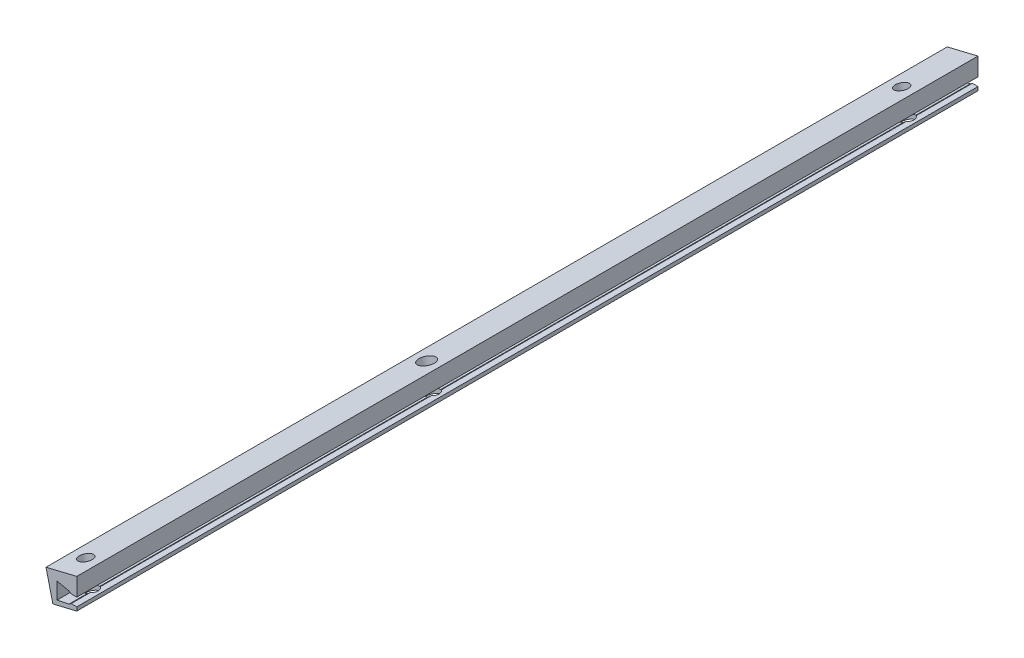
ISO-10303-21;
HEADER;
FILE_DESCRIPTION(('STEP AP214'),'2;1');
FILE_NAME('part.step','',(''),(''),'','','');
FILE_SCHEMA(('AUTOMOTIVE_DESIGN { 1 0 10303 214 1 1 1 1 }'));
ENDSEC;
DATA;
#1=APPLICATION_CONTEXT('core data for automotive mechanical design processes');
#2=APPLICATION_PROTOCOL_DEFINITION('international standard','automotive_design',2000,#1);
#3=PRODUCT_CONTEXT('',#1,'mechanical');
#4=PRODUCT('Part','Part','',(#3));
#5=PRODUCT_RELATED_PRODUCT_CATEGORY('part','',(#4));
#6=PRODUCT_DEFINITION_FORMATION('','',#4);
#7=PRODUCT_DEFINITION_CONTEXT('part definition',#1,'design');
#8=PRODUCT_DEFINITION('design','',#6,#7);
#9=PRODUCT_DEFINITION_SHAPE('','',#8);
#10=(LENGTH_UNIT() NAMED_UNIT(*) SI_UNIT(.MILLI.,.METRE.));
#11=(NAMED_UNIT(*) PLANE_ANGLE_UNIT() SI_UNIT($,.RADIAN.));
#12=(NAMED_UNIT(*) SI_UNIT($,.STERADIAN.) SOLID_ANGLE_UNIT());
#13=UNCERTAINTY_MEASURE_WITH_UNIT(LENGTH_MEASURE(1.E-05),#10,'distance_accuracy_value','');
#14=(GEOMETRIC_REPRESENTATION_CONTEXT(3) GLOBAL_UNCERTAINTY_ASSIGNED_CONTEXT((#13)) GLOBAL_UNIT_ASSIGNED_CONTEXT((#10,
#11,#12)) REPRESENTATION_CONTEXT('',''));
#15=CARTESIAN_POINT('',(0.,0.,0.));
#16=DIRECTION('',(0.,0.,1.));
#17=DIRECTION('',(1.,0.,0.));
#18=AXIS2_PLACEMENT_3D('',#15,#16,#17);
#19=CARTESIAN_POINT('',(59.958612412913,1.62114936826575,248.819721939639));
#20=DIRECTION('',(0.207911690817757,0.978147600733806,0.));
#21=DIRECTION('',(-0.978147600733806,0.207911690817757,0.));
#22=AXIS2_PLACEMENT_3D('',#19,#20,#21);
#23=PLANE('',#22);
#24=CARTESIAN_POINT('',(58.6808585005971,1.89274434652803,139.7));
#25=DIRECTION('',(0.207911690817757,0.978147600733806,0.));
#26=DIRECTION('',(-0.978147600733806,0.207911690817757,0.));
#27=AXIS2_PLACEMENT_3D('',#24,#25,#26);
#28=ELLIPSE('',#27,2.16681515513089,1.95386478333267);
#29=CARTESIAN_POINT('',(56.834412412913,2.28521857823523,140.659259564191));
#30=VERTEX_POINT('',#29);
#31=CARTESIAN_POINT('',(59.3577274417419,1.74887141169708,141.551548722555));
#32=VERTEX_POINT('',#31);
#33=EDGE_CURVE('E306',#30,#32,#28,.T.);
#34=ORIENTED_EDGE('',*,*,#33,.T.);
#35=DIRECTION('',(0.,0.,-1.));
#36=VECTOR('',#35,1.);
#37=CARTESIAN_POINT('',(59.3577274417419,1.74887141169707,248.819721939639));
#38=LINE('',#37,#36);
#39=CARTESIAN_POINT('',(59.3577274417419,1.74887141169707,141.323519295234));
#40=VERTEX_POINT('',#39);
#41=EDGE_CURVE('E42',#32,#40,#38,.T.);
#42=ORIENTED_EDGE('',*,*,#41,.T.);
#43=CARTESIAN_POINT('',(58.7184617697407,1.88475152493132,139.7));
#44=DIRECTION('',(0.207911690817757,0.978147600733806,0.));
#45=DIRECTION('',(-0.978147600733806,0.207911690817757,0.));
#46=AXIS2_PLACEMENT_3D('',#43,#44,#45);
#47=ELLIPSE('',#46,1.91514484381711,1.7272);
#48=CARTESIAN_POINT('',(59.958612412913,1.62114936826575,140.9945187615));
#49=VERTEX_POINT('',#48);
#50=EDGE_CURVE('E315',#40,#49,#47,.T.);
#51=ORIENTED_EDGE('',*,*,#50,.T.);
#52=DIRECTION('',(0.,0.,-1.));
#53=VECTOR('',#52,1.);
#54=CARTESIAN_POINT('',(59.958612412913,1.62114936826575,248.819721939639));
#55=LINE('',#54,#53);
#56=CARTESIAN_POINT('',(59.958612412913,1.62114936826575,227.267007538489));
#57=VERTEX_POINT('',#56);
#58=EDGE_CURVE('E279',#57,#49,#55,.T.);
#59=ORIENTED_EDGE('',*,*,#58,.F.);
#60=CARTESIAN_POINT('',(58.7184617697407,1.88475152493132,228.561526299989));
#61=DIRECTION('',(0.207911690817757,0.978147600733806,0.));
#62=DIRECTION('',(-0.978147600733806,0.207911690817757,0.));
#63=AXIS2_PLACEMENT_3D('',#60,#61,#62);
#64=ELLIPSE('',#63,1.91514484381711,1.7272);
#65=CARTESIAN_POINT('',(59.958612412913,1.62114936826575,229.856045061488));
#66=VERTEX_POINT('',#65);
#67=EDGE_CURVE('E412',#57,#66,#64,.T.);
#68=ORIENTED_EDGE('',*,*,#67,.T.);
#69=CARTESIAN_POINT('',(59.958612412913,1.62114936826575,234.911526299989));
#70=VERTEX_POINT('',#69);
#71=EDGE_CURVE('E275',#70,#66,#55,.T.);
#72=ORIENTED_EDGE('',*,*,#71,.F.);
#73=DIRECTION('',(0.978147600733806,-0.207911690817757,0.));
#74=VECTOR('',#73,1.);
#75=CARTESIAN_POINT('',(56.834412412913,2.28521857823523,234.911526299989));
#76=LINE('',#75,#74);
#77=CARTESIAN_POINT('',(56.834412412913,2.28521857823523,234.911526299989));
#78=VERTEX_POINT('',#77);
#79=EDGE_CURVE('E368',#78,#70,#76,.T.);
#80=ORIENTED_EDGE('',*,*,#79,.F.);
#81=DIRECTION('',(0.,0.,-1.));
#82=VECTOR('',#81,1.);
#83=CARTESIAN_POINT('',(56.834412412913,2.28521857823523,248.819721939639));
#84=LINE('',#83,#82);
#85=EDGE_CURVE('E280',#78,#30,#84,.T.);
#86=ORIENTED_EDGE('',*,*,#85,.T.);
#87=EDGE_LOOP('',(#34,#42,#51,#59,#68,#72,#80,#86));
#88=FACE_BOUND('',#87,.T.);
#89=ADVANCED_FACE('F33',(#88),#23,.F.);
#90=CARTESIAN_POINT('',(59.958612412913,1.62114936826575,248.819721939639));
#91=DIRECTION('',(0.573576436351041,0.819152044288996,0.));
#92=DIRECTION('',(-0.819152044288996,0.573576436351041,0.));
#93=AXIS2_PLACEMENT_3D('',#90,#91,#92);
#94=PLANE('',#93);
#95=ORIENTED_EDGE('',*,*,#71,.T.);
#96=CARTESIAN_POINT('',(58.5423833987237,2.61280359983237,228.561526299989));
#97=DIRECTION('',(0.573576436351041,0.819152044288996,0.));
#98=DIRECTION('',(-0.819152044288996,0.573576436351041,0.));
#99=AXIS2_PLACEMENT_3D('',#96,#97,#98);
#100=ELLIPSE('',#99,2.61156322728282,1.7272);
#101=CARTESIAN_POINT('',(60.5247028481059,1.22476857823525,229.210889323264));
#102=VERTEX_POINT('',#101);
#103=EDGE_CURVE('E411',#66,#102,#100,.T.);
#104=ORIENTED_EDGE('',*,*,#103,.T.);
#105=DIRECTION('',(0.,0.,-1.));
#106=VECTOR('',#105,1.);
#107=CARTESIAN_POINT('',(60.5247028481059,1.22476857823525,248.819721939639));
#108=LINE('',#107,#106);
#109=CARTESIAN_POINT('',(60.5247028481059,1.22476857823525,234.911526299989));
#110=VERTEX_POINT('',#109);
#111=EDGE_CURVE('E270',#110,#102,#108,.T.);
#112=ORIENTED_EDGE('',*,*,#111,.F.);
#113=DIRECTION('',(0.819152044288995,-0.573576436351042,0.));
#114=VECTOR('',#113,1.);
#115=CARTESIAN_POINT('',(59.958612412913,1.62114936826575,234.911526299989));
#116=LINE('',#115,#114);
#117=EDGE_CURVE('E370',#70,#110,#116,.T.);
#118=ORIENTED_EDGE('',*,*,#117,.F.);
#119=EDGE_LOOP('',(#95,#104,#112,#118));
#120=FACE_BOUND('',#119,.T.);
#121=ADVANCED_FACE('F454',(#120),#94,.F.);
#122=CARTESIAN_POINT('',(59.9586124129129,-1.35601221179529,248.819721939639));
#123=DIRECTION('',(0.57357643635104,-0.819152044288996,0.));
#124=DIRECTION('',(0.819152044288996,0.57357643635104,0.));
#125=AXIS2_PLACEMENT_3D('',#122,#123,#124);
#126=PLANE('',#125);
#127=DIRECTION('',(0.,0.,-1.));
#128=VECTOR('',#127,1.);
#129=CARTESIAN_POINT('',(60.5247028481059,-0.959631421764766,248.819721939639));
#130=LINE('',#129,#128);
#131=CARTESIAN_POINT('',(60.5247028481059,-0.959631421764765,234.911526299989));
#132=VERTEX_POINT('',#131);
#133=CARTESIAN_POINT('',(60.5247028481059,-0.959631421764766,229.903787627549));
#134=VERTEX_POINT('',#133);
#135=EDGE_CURVE('E291',#132,#134,#130,.T.);
#136=ORIENTED_EDGE('',*,*,#135,.T.);
#137=CARTESIAN_POINT('',(59.568328281914,-1.62929210236432,228.561526299989));
#138=DIRECTION('',(0.57357643635104,-0.819152044288996,0.));
#139=DIRECTION('',(0.819152044288996,0.57357643635104,0.));
#140=AXIS2_PLACEMENT_3D('',#137,#138,#139);
#141=ELLIPSE('',#140,1.85515103406872,1.7272);
#142=CARTESIAN_POINT('',(59.9586124129129,-1.35601221179529,230.230792479924));
#143=VERTEX_POINT('',#142);
#144=EDGE_CURVE('E404',#134,#143,#141,.T.);
#145=ORIENTED_EDGE('',*,*,#144,.T.);
#146=DIRECTION('',(0.,0.,-1.));
#147=VECTOR('',#146,1.);
#148=CARTESIAN_POINT('',(59.9586124129129,-1.35601221179529,248.819721939639));
#149=LINE('',#148,#147);
#150=CARTESIAN_POINT('',(59.9586124129129,-1.35601221179529,234.911526299989));
#151=VERTEX_POINT('',#150);
#152=EDGE_CURVE('E286',#151,#143,#149,.T.);
#153=ORIENTED_EDGE('',*,*,#152,.F.);
#154=DIRECTION('',(-0.819152044288996,-0.573576436351041,0.));
#155=VECTOR('',#154,1.);
#156=CARTESIAN_POINT('',(60.5247028481059,-0.959631421764765,234.911526299989));
#157=LINE('',#156,#155);
#158=EDGE_CURVE('E362',#132,#151,#157,.T.);
#159=ORIENTED_EDGE('',*,*,#158,.F.);
#160=EDGE_LOOP('',(#136,#145,#153,#159));
#161=FACE_BOUND('',#160,.T.);
#162=ADVANCED_FACE('F483',(#161),#126,.F.);
#163=CARTESIAN_POINT('',(60.5247028481059,1.22476857823525,227.912163276713));
#164=VERTEX_POINT('',#163);
#165=CARTESIAN_POINT('',(60.5247028481059,1.22476857823525,140.349363023275));
#166=VERTEX_POINT('',#165);
#167=EDGE_CURVE('E274',#164,#166,#108,.T.);
#168=ORIENTED_EDGE('',*,*,#167,.F.);
#169=EDGE_CURVE('E57',#164,#57,#100,.T.);
#170=ORIENTED_EDGE('',*,*,#169,.T.);
#171=ORIENTED_EDGE('',*,*,#58,.T.);
#172=CARTESIAN_POINT('',(58.5423833987237,2.61280359983237,139.7));
#173=DIRECTION('',(0.573576436351041,0.819152044288996,0.));
#174=DIRECTION('',(-0.819152044288996,0.573576436351041,0.));
#175=AXIS2_PLACEMENT_3D('',#172,#173,#174);
#176=ELLIPSE('',#175,2.61156322728282,1.7272);
#177=EDGE_CURVE('E325',#49,#166,#176,.T.);
#178=ORIENTED_EDGE('',*,*,#177,.T.);
#179=EDGE_LOOP('',(#168,#170,#171,#178));
#180=FACE_BOUND('',#179,.T.);
#181=ADVANCED_FACE('F448',(#180),#94,.F.);
#182=CARTESIAN_POINT('',(59.9586124129129,-1.35601221179529,226.892260120053));
#183=VERTEX_POINT('',#182);
#184=CARTESIAN_POINT('',(59.9586124129129,-1.35601221179529,141.369266179935));
#185=VERTEX_POINT('',#184);
#186=EDGE_CURVE('E290',#183,#185,#149,.T.);
#187=ORIENTED_EDGE('',*,*,#186,.F.);
#188=CARTESIAN_POINT('',(60.5247028481059,-0.959631421764766,227.219264972428));
#189=VERTEX_POINT('',#188);
#190=EDGE_CURVE('E401',#183,#189,#141,.T.);
#191=ORIENTED_EDGE('',*,*,#190,.T.);
#192=CARTESIAN_POINT('',(60.5247028481059,-0.959631421764766,141.04226132756));
#193=VERTEX_POINT('',#192);
#194=EDGE_CURVE('E295',#189,#193,#130,.T.);
#195=ORIENTED_EDGE('',*,*,#194,.T.);
#196=CARTESIAN_POINT('',(59.568328281914,-1.62929210236432,139.7));
#197=DIRECTION('',(0.57357643635104,-0.819152044288996,0.));
#198=DIRECTION('',(0.819152044288996,0.57357643635104,0.));
#199=AXIS2_PLACEMENT_3D('',#196,#197,#198);
#200=ELLIPSE('',#199,1.85515103406872,1.7272);
#201=EDGE_CURVE('E418',#193,#185,#200,.T.);
#202=ORIENTED_EDGE('',*,*,#201,.T.);
#203=EDGE_LOOP('',(#187,#191,#195,#202));
#204=FACE_BOUND('',#203,.T.);
#205=ADVANCED_FACE('F490',(#204),#126,.F.);
#206=CARTESIAN_POINT('',(60.5247028481059,1.22476857823525,139.050636976724));
#207=VERTEX_POINT('',#206);
#208=CARTESIAN_POINT('',(60.5247028481059,1.22476857823525,16.5243630232753));
#209=VERTEX_POINT('',#208);
#210=EDGE_CURVE('E432',#207,#209,#108,.T.);
#211=ORIENTED_EDGE('',*,*,#210,.F.);
#212=CARTESIAN_POINT('',(59.958612412913,1.62114936826575,138.4054812385));
#213=VERTEX_POINT('',#212);
#214=EDGE_CURVE('E329',#207,#213,#176,.T.);
#215=ORIENTED_EDGE('',*,*,#214,.T.);
#216=CARTESIAN_POINT('',(59.958612412913,1.62114936826575,17.1695187614996));
#217=VERTEX_POINT('',#216);
#218=EDGE_CURVE('E430',#213,#217,#55,.T.);
#219=ORIENTED_EDGE('',*,*,#218,.T.);
#220=CARTESIAN_POINT('',(58.5423833987236,2.61280359983242,15.8749999999998));
#221=DIRECTION('',(0.573576436351041,0.819152044288996,0.));
#222=DIRECTION('',(-0.819152044288996,0.573576436351041,0.));
#223=AXIS2_PLACEMENT_3D('',#220,#221,#222);
#224=ELLIPSE('',#223,2.61156322728281,1.72719999999999);
#225=EDGE_CURVE('E351',#217,#209,#224,.T.);
#226=ORIENTED_EDGE('',*,*,#225,.T.);
#227=EDGE_LOOP('',(#211,#215,#219,#226));
#228=FACE_BOUND('',#227,.T.);
#229=ADVANCED_FACE('F428',(#228),#94,.F.);
#230=CARTESIAN_POINT('',(59.9586124129129,-1.35601221179529,138.030733820064));
#231=VERTEX_POINT('',#230);
#232=CARTESIAN_POINT('',(59.9586124129129,-1.35601221179529,17.5442661799356));
#233=VERTEX_POINT('',#232);
#234=EDGE_CURVE('E471',#231,#233,#149,.T.);
#235=ORIENTED_EDGE('',*,*,#234,.F.);
#236=CARTESIAN_POINT('',(60.5247028481059,-0.959631421764766,138.35773867244));
#237=VERTEX_POINT('',#236);
#238=EDGE_CURVE('E415',#231,#237,#200,.T.);
#239=ORIENTED_EDGE('',*,*,#238,.T.);
#240=CARTESIAN_POINT('',(60.5247028481059,-0.959631421764766,17.2172613275601));
#241=VERTEX_POINT('',#240);
#242=EDGE_CURVE('E475',#237,#241,#130,.T.);
#243=ORIENTED_EDGE('',*,*,#242,.T.);
#244=CARTESIAN_POINT('',(59.568328281914,-1.62929210236435,15.8749999999998));
#245=DIRECTION('',(0.57357643635104,-0.819152044288996,0.));
#246=DIRECTION('',(0.819152044288996,0.57357643635104,0.));
#247=AXIS2_PLACEMENT_3D('',#244,#245,#246);
#248=ELLIPSE('',#247,1.85515103406871,1.72719999999999);
#249=EDGE_CURVE('E341',#241,#233,#248,.T.);
#250=ORIENTED_EDGE('',*,*,#249,.T.);
#251=EDGE_LOOP('',(#235,#239,#243,#250));
#252=FACE_BOUND('',#251,.T.);
#253=ADVANCED_FACE('F498',(#252),#126,.F.);
#254=CARTESIAN_POINT('',(0.,0.,0.));
#255=DIRECTION('',(0.,0.,-1.));
#256=DIRECTION('',(-1.,0.,0.));
#257=AXIS2_PLACEMENT_3D('',#254,#255,#256);
#258=PLANE('',#257);
#259=DIRECTION('',(-0.971978073490253,-0.235071530930855,0.));
#260=VECTOR('',#259,1.);
#261=CARTESIAN_POINT('',(55.7581784819439,-3.43350010678022,0.));
#262=LINE('',#261,#260);
#263=CARTESIAN_POINT('',(61.990612412913,-1.92619472043808,0.));
#264=VERTEX_POINT('',#263);
#265=CARTESIAN_POINT('',(55.7581784819439,-3.43350010678022,0.));
#266=VERTEX_POINT('',#265);
#267=EDGE_CURVE('E213',#264,#266,#262,.T.);
#268=ORIENTED_EDGE('',*,*,#267,.T.);
#269=DIRECTION('',(0.235071530930851,-0.971978073490254,0.));
#270=VECTOR('',#269,1.);
#271=CARTESIAN_POINT('',(53.9669334162508,3.97297281321551,0.));
#272=LINE('',#271,#270);
#273=CARTESIAN_POINT('',(53.9669334162508,3.97297281321551,0.));
#274=VERTEX_POINT('',#273);
#275=EDGE_CURVE('E376',#274,#266,#272,.T.);
#276=ORIENTED_EDGE('',*,*,#275,.F.);
#277=DIRECTION('',(0.971978073490256,0.235071530930842,0.));
#278=VECTOR('',#277,1.);
#279=CARTESIAN_POINT('',(2.07437631216601,-8.57716918594505,0.));
#280=LINE('',#279,#278);
#281=CARTESIAN_POINT('',(61.990612412913,5.91348830104975,0.));
#282=VERTEX_POINT('',#281);
#283=EDGE_CURVE('E243',#274,#282,#280,.T.);
#284=ORIENTED_EDGE('',*,*,#283,.T.);
#285=DIRECTION('',(0.,1.,0.));
#286=VECTOR('',#285,1.);
#287=CARTESIAN_POINT('',(61.990612412913,3.57048443495228,0.));
#288=LINE('',#287,#286);
#289=CARTESIAN_POINT('',(61.990612412913,1.22476857823525,0.));
#290=VERTEX_POINT('',#289);
#291=EDGE_CURVE('E264',#290,#282,#288,.T.);
#292=ORIENTED_EDGE('',*,*,#291,.F.);
#293=DIRECTION('',(1.,0.,0.));
#294=VECTOR('',#293,1.);
#295=CARTESIAN_POINT('',(61.990612412913,1.22476857823525,0.));
#296=LINE('',#295,#294);
#297=CARTESIAN_POINT('',(60.5247028481059,1.22476857823525,0.));
#298=VERTEX_POINT('',#297);
#299=EDGE_CURVE('E261',#298,#290,#296,.T.);
#300=ORIENTED_EDGE('',*,*,#299,.F.);
#301=DIRECTION('',(0.819152044288996,-0.573576436351041,0.));
#302=VECTOR('',#301,1.);
#303=CARTESIAN_POINT('',(59.958612412913,1.62114936826575,0.));
#304=LINE('',#303,#302);
#305=CARTESIAN_POINT('',(59.958612412913,1.62114936826575,0.));
#306=VERTEX_POINT('',#305);
#307=EDGE_CURVE('E258',#306,#298,#304,.T.);
#308=ORIENTED_EDGE('',*,*,#307,.F.);
#309=DIRECTION('',(0.978147600733806,-0.207911690817757,0.));
#310=VECTOR('',#309,1.);
#311=CARTESIAN_POINT('',(59.958612412913,1.62114936826575,0.));
#312=LINE('',#311,#310);
#313=CARTESIAN_POINT('',(56.834412412913,2.28521857823523,0.));
#314=VERTEX_POINT('',#313);
#315=EDGE_CURVE('E255',#314,#306,#312,.T.);
#316=ORIENTED_EDGE('',*,*,#315,.F.);
#317=DIRECTION('',(0.,1.,0.));
#318=VECTOR('',#317,1.);
#319=CARTESIAN_POINT('',(56.834412412913,2.28521857823523,0.));
#320=LINE('',#319,#318);
#321=CARTESIAN_POINT('',(56.834412412913,-2.02008142176476,0.));
#322=VERTEX_POINT('',#321);
#323=EDGE_CURVE('E252',#322,#314,#320,.T.);
#324=ORIENTED_EDGE('',*,*,#323,.F.);
#325=DIRECTION('',(-0.978147600733805,-0.207911690817762,0.));
#326=VECTOR('',#325,1.);
#327=CARTESIAN_POINT('',(56.834412412913,-2.02008142176476,0.));
#328=LINE('',#327,#326);
#329=CARTESIAN_POINT('',(59.9586124129129,-1.35601221179529,0.));
#330=VERTEX_POINT('',#329);
#331=EDGE_CURVE('E249',#330,#322,#328,.T.);
#332=ORIENTED_EDGE('',*,*,#331,.F.);
#333=DIRECTION('',(-0.819152044288996,-0.57357643635104,0.));
#334=VECTOR('',#333,1.);
#335=CARTESIAN_POINT('',(59.9586124129129,-1.35601221179529,0.));
#336=LINE('',#335,#334);
#337=CARTESIAN_POINT('',(60.5247028481059,-0.959631421764766,0.));
#338=VERTEX_POINT('',#337);
#339=EDGE_CURVE('E241',#338,#330,#336,.T.);
#340=ORIENTED_EDGE('',*,*,#339,.F.);
#341=DIRECTION('',(-1.,0.,0.));
#342=VECTOR('',#341,1.);
#343=CARTESIAN_POINT('',(60.5247028481059,-0.959631421764766,0.));
#344=LINE('',#343,#342);
#345=CARTESIAN_POINT('',(61.990612412913,-0.959631421764751,0.));
#346=VERTEX_POINT('',#345);
#347=EDGE_CURVE('E238',#346,#338,#344,.T.);
#348=ORIENTED_EDGE('',*,*,#347,.F.);
#349=DIRECTION('',(0.,1.,0.));
#350=VECTOR('',#349,1.);
#351=CARTESIAN_POINT('',(61.990612412913,-0.959631421764751,0.));
#352=LINE('',#351,#350);
#353=EDGE_CURVE('E230',#264,#346,#352,.T.);
#354=ORIENTED_EDGE('',*,*,#353,.F.);
#355=EDGE_LOOP('',(#268,#276,#284,#292,#300,#308,#316,#324,#332,#340,#348,#354));
#356=FACE_BOUND('',#355,.T.);
#357=ADVANCED_FACE('F235',(#356),#258,.T.);
#358=CARTESIAN_POINT('',(61.990612412913,3.57048443495228,248.819721939639));
#359=DIRECTION('',(-1.,0.,0.));
#360=DIRECTION('',(0.,-1.,0.));
#361=AXIS2_PLACEMENT_3D('',#358,#359,#360);
#362=PLANE('',#361);
#363=DIRECTION('',(0.,0.,-1.));
#364=VECTOR('',#363,1.);
#365=CARTESIAN_POINT('',(61.990612412913,5.91348830104975,242.911985465671));
#366=LINE('',#365,#364);
#367=CARTESIAN_POINT('',(61.990612412913,5.91348830104975,234.911526299989));
#368=VERTEX_POINT('',#367);
#369=EDGE_CURVE('E239',#368,#282,#366,.T.);
#370=ORIENTED_EDGE('',*,*,#369,.F.);
#371=DIRECTION('',(0.,1.,0.));
#372=VECTOR('',#371,1.);
#373=CARTESIAN_POINT('',(61.990612412913,1.22476857823525,234.911526299989));
#374=LINE('',#373,#372);
#375=CARTESIAN_POINT('',(61.990612412913,1.22476857823525,234.911526299989));
#376=VERTEX_POINT('',#375);
#377=EDGE_CURVE('E355',#376,#368,#374,.T.);
#378=ORIENTED_EDGE('',*,*,#377,.F.);
#379=DIRECTION('',(0.,0.,-1.));
#380=VECTOR('',#379,1.);
#381=CARTESIAN_POINT('',(61.990612412913,1.22476857823525,248.819721939639));
#382=LINE('',#381,#380);
#383=EDGE_CURVE('E267',#376,#290,#382,.T.);
#384=ORIENTED_EDGE('',*,*,#383,.T.);
#385=ORIENTED_EDGE('',*,*,#291,.T.);
#386=EDGE_LOOP('',(#370,#378,#384,#385));
#387=FACE_BOUND('',#386,.T.);
#388=ADVANCED_FACE('F532',(#387),#362,.F.);
#389=CARTESIAN_POINT('',(61.990612412913,1.22476857823525,248.819721939639));
#390=DIRECTION('',(0.,1.,0.));
#391=DIRECTION('',(0.,0.,1.));
#392=AXIS2_PLACEMENT_3D('',#389,#390,#391);
#393=PLANE('',#392);
#394=ORIENTED_EDGE('',*,*,#111,.T.);
#395=CARTESIAN_POINT('',(58.8780777177743,1.22476857823525,228.561526299989));
#396=DIRECTION('',(0.,1.,0.));
#397=DIRECTION('',(-1.,0.,0.));
#398=AXIS2_PLACEMENT_3D('',#395,#396,#397);
#399=ELLIPSE('',#398,1.7769948182039,1.7272);
#400=EDGE_CURVE('E408',#102,#164,#399,.T.);
#401=ORIENTED_EDGE('',*,*,#400,.T.);
#402=ORIENTED_EDGE('',*,*,#167,.T.);
#403=CARTESIAN_POINT('',(58.8780777177743,1.22476857823525,139.7));
#404=DIRECTION('',(0.,1.,0.));
#405=DIRECTION('',(-1.,0.,0.));
#406=AXIS2_PLACEMENT_3D('',#403,#404,#405);
#407=ELLIPSE('',#406,1.7769948182039,1.7272);
#408=EDGE_CURVE('E421',#166,#207,#407,.T.);
#409=ORIENTED_EDGE('',*,*,#408,.T.);
#410=ORIENTED_EDGE('',*,*,#210,.T.);
#411=CARTESIAN_POINT('',(58.8780777177743,1.22476857823525,15.8749999999998));
#412=DIRECTION('',(0.,1.,0.));
#413=DIRECTION('',(-1.,0.,0.));
#414=AXIS2_PLACEMENT_3D('',#411,#412,#413);
#415=ELLIPSE('',#414,1.7769948182039,1.72719999999999);
#416=CARTESIAN_POINT('',(60.5247028481059,1.22476857823525,15.2256369767246));
#417=VERTEX_POINT('',#416);
#418=EDGE_CURVE('E352',#209,#417,#415,.T.);
#419=ORIENTED_EDGE('',*,*,#418,.T.);
#420=EDGE_CURVE('E269',#417,#298,#108,.T.);
#421=ORIENTED_EDGE('',*,*,#420,.T.);
#422=ORIENTED_EDGE('',*,*,#299,.T.);
#423=ORIENTED_EDGE('',*,*,#383,.F.);
#424=DIRECTION('',(1.,0.,0.));
#425=VECTOR('',#424,1.);
#426=CARTESIAN_POINT('',(60.5247028481059,1.22476857823525,234.911526299989));
#427=LINE('',#426,#425);
#428=EDGE_CURVE('E372',#110,#376,#427,.T.);
#429=ORIENTED_EDGE('',*,*,#428,.F.);
#430=EDGE_LOOP('',(#394,#401,#402,#409,#410,#419,#421,#422,#423,#429));
#431=FACE_BOUND('',#430,.T.);
#432=ADVANCED_FACE('F443',(#431),#393,.F.);
#433=ORIENTED_EDGE('',*,*,#420,.F.);
#434=CARTESIAN_POINT('',(59.958612412913,1.62114936826575,14.5804812385001));
#435=VERTEX_POINT('',#434);
#436=EDGE_CURVE('E348',#417,#435,#224,.T.);
#437=ORIENTED_EDGE('',*,*,#436,.T.);
#438=EDGE_CURVE('E273',#435,#306,#55,.T.);
#439=ORIENTED_EDGE('',*,*,#438,.T.);
#440=ORIENTED_EDGE('',*,*,#307,.T.);
#441=EDGE_LOOP('',(#433,#437,#439,#440));
#442=FACE_BOUND('',#441,.T.);
#443=ADVANCED_FACE('F437',(#442),#94,.F.);
#444=CARTESIAN_POINT('',(59.3577274417419,1.74887141169707,138.076480704766));
#445=VERTEX_POINT('',#444);
#446=EDGE_CURVE('E326',#213,#445,#47,.T.);
#447=ORIENTED_EDGE('',*,*,#446,.T.);
#448=CARTESIAN_POINT('',(59.3577274417419,1.74887141169708,137.848451277444));
#449=VERTEX_POINT('',#448);
#450=EDGE_CURVE('E305',#445,#449,#38,.T.);
#451=ORIENTED_EDGE('',*,*,#450,.T.);
#452=CARTESIAN_POINT('',(56.834412412913,2.28521857823523,138.740740435809));
#453=VERTEX_POINT('',#452);
#454=EDGE_CURVE('E303',#449,#453,#28,.T.);
#455=ORIENTED_EDGE('',*,*,#454,.T.);
#456=EDGE_CURVE('E278',#453,#314,#84,.T.);
#457=ORIENTED_EDGE('',*,*,#456,.T.);
#458=ORIENTED_EDGE('',*,*,#315,.T.);
#459=ORIENTED_EDGE('',*,*,#438,.F.);
#460=CARTESIAN_POINT('',(58.7184617697406,1.88475152493133,15.8749999999998));
#461=DIRECTION('',(0.207911690817757,0.978147600733806,0.));
#462=DIRECTION('',(-0.978147600733806,0.207911690817757,0.));
#463=AXIS2_PLACEMENT_3D('',#460,#461,#462);
#464=ELLIPSE('',#463,1.9151448438171,1.72719999999999);
#465=EDGE_CURVE('E345',#435,#217,#464,.T.);
#466=ORIENTED_EDGE('',*,*,#465,.T.);
#467=ORIENTED_EDGE('',*,*,#218,.F.);
#468=EDGE_LOOP('',(#447,#451,#455,#457,#458,#459,#466,#467));
#469=FACE_BOUND('',#468,.T.);
#470=ADVANCED_FACE('F433',(#469),#23,.F.);
#471=CARTESIAN_POINT('',(56.834412412913,2.28521857823523,248.819721939639));
#472=DIRECTION('',(-1.,0.,0.));
#473=DIRECTION('',(0.,-1.,0.));
#474=AXIS2_PLACEMENT_3D('',#471,#472,#473);
#475=PLANE('',#474);
#476=ORIENTED_EDGE('',*,*,#456,.F.);
#477=CARTESIAN_POINT('',(56.8344124129129,11.1762245326475,139.7));
#478=DIRECTION('',(-1.,0.,0.));
#479=DIRECTION('',(0.,1.,0.));
#480=AXIS2_PLACEMENT_3D('',#477,#478,#479);
#481=ELLIPSE('',#480,9.80316892780164,2.27726333667067);
#482=EDGE_CURVE('E49',#453,#30,#481,.T.);
#483=ORIENTED_EDGE('',*,*,#482,.T.);
#484=ORIENTED_EDGE('',*,*,#85,.F.);
#485=DIRECTION('',(0.,1.,0.));
#486=VECTOR('',#485,1.);
#487=CARTESIAN_POINT('',(56.834412412913,-2.02008142176476,234.911526299989));
#488=LINE('',#487,#486);
#489=CARTESIAN_POINT('',(56.834412412913,-2.02008142176476,234.911526299989));
#490=VERTEX_POINT('',#489);
#491=EDGE_CURVE('E366',#490,#78,#488,.T.);
#492=ORIENTED_EDGE('',*,*,#491,.F.);
#493=DIRECTION('',(0.,0.,-1.));
#494=VECTOR('',#493,1.);
#495=CARTESIAN_POINT('',(56.834412412913,-2.02008142176476,248.819721939639));
#496=LINE('',#495,#494);
#497=EDGE_CURVE('E283',#490,#322,#496,.T.);
#498=ORIENTED_EDGE('',*,*,#497,.T.);
#499=ORIENTED_EDGE('',*,*,#323,.T.);
#500=EDGE_LOOP('',(#476,#483,#484,#492,#498,#499));
#501=FACE_BOUND('',#500,.T.);
#502=ADVANCED_FACE('F462',(#501),#475,.F.);
#503=CARTESIAN_POINT('',(56.834412412913,-2.02008142176476,248.819721939639));
#504=DIRECTION('',(0.207911690817762,-0.978147600733805,0.));
#505=DIRECTION('',(0.978147600733805,0.207911690817762,0.));
#506=AXIS2_PLACEMENT_3D('',#503,#504,#505);
#507=PLANE('',#506);
#508=ORIENTED_EDGE('',*,*,#152,.T.);
#509=CARTESIAN_POINT('',(59.5245495780698,-1.44827511551828,228.561526299989));
#510=DIRECTION('',(0.207911690817762,-0.978147600733805,0.));
#511=DIRECTION('',(-0.978147600733805,-0.207911690817762,0.));
#512=AXIS2_PLACEMENT_3D('',#509,#510,#511);
#513=ELLIPSE('',#512,1.72787017170871,1.7272);
#514=EDGE_CURVE('E405',#143,#183,#513,.T.);
#515=ORIENTED_EDGE('',*,*,#514,.T.);
#516=ORIENTED_EDGE('',*,*,#186,.T.);
#517=CARTESIAN_POINT('',(59.5245495780698,-1.44827511551828,139.7));
#518=DIRECTION('',(0.207911690817762,-0.978147600733805,0.));
#519=DIRECTION('',(-0.978147600733805,-0.207911690817762,0.));
#520=AXIS2_PLACEMENT_3D('',#517,#518,#519);
#521=ELLIPSE('',#520,1.72787017170871,1.7272);
#522=EDGE_CURVE('E297',#185,#231,#521,.T.);
#523=ORIENTED_EDGE('',*,*,#522,.T.);
#524=ORIENTED_EDGE('',*,*,#234,.T.);
#525=CARTESIAN_POINT('',(59.5245495780698,-1.44827511551829,15.8749999999998));
#526=DIRECTION('',(0.207911690817762,-0.978147600733805,0.));
#527=DIRECTION('',(-0.978147600733805,-0.207911690817762,0.));
#528=AXIS2_PLACEMENT_3D('',#525,#526,#527);
#529=ELLIPSE('',#528,1.7278701717087,1.72719999999999);
#530=CARTESIAN_POINT('',(59.9586124129129,-1.35601221179529,14.2057338200643));
#531=VERTEX_POINT('',#530);
#532=EDGE_CURVE('E342',#233,#531,#529,.T.);
#533=ORIENTED_EDGE('',*,*,#532,.T.);
#534=EDGE_CURVE('E285',#531,#330,#149,.T.);
#535=ORIENTED_EDGE('',*,*,#534,.T.);
#536=ORIENTED_EDGE('',*,*,#331,.T.);
#537=ORIENTED_EDGE('',*,*,#497,.F.);
#538=DIRECTION('',(-0.978147600733805,-0.207911690817762,0.));
#539=VECTOR('',#538,1.);
#540=CARTESIAN_POINT('',(59.9586124129129,-1.35601221179529,234.911526299989));
#541=LINE('',#540,#539);
#542=EDGE_CURVE('E364',#151,#490,#541,.T.);
#543=ORIENTED_EDGE('',*,*,#542,.F.);
#544=EDGE_LOOP('',(#508,#515,#516,#523,#524,#533,#535,#536,#537,#543));
#545=FACE_BOUND('',#544,.T.);
#546=ADVANCED_FACE('F466',(#545),#507,.F.);
#547=ORIENTED_EDGE('',*,*,#534,.F.);
#548=CARTESIAN_POINT('',(60.5247028481059,-0.959631421764766,14.5327386724396));
#549=VERTEX_POINT('',#548);
#550=EDGE_CURVE('E338',#531,#549,#248,.T.);
#551=ORIENTED_EDGE('',*,*,#550,.T.);
#552=EDGE_CURVE('E289',#549,#338,#130,.T.);
#553=ORIENTED_EDGE('',*,*,#552,.T.);
#554=ORIENTED_EDGE('',*,*,#339,.T.);
#555=EDGE_LOOP('',(#547,#551,#553,#554));
#556=FACE_BOUND('',#555,.T.);
#557=ADVANCED_FACE('F472',(#556),#126,.F.);
#558=CARTESIAN_POINT('',(60.5247028481059,-0.959631421764766,248.819721939639));
#559=DIRECTION('',(0.,-1.,0.));
#560=DIRECTION('',(1.,0.,0.));
#561=AXIS2_PLACEMENT_3D('',#558,#559,#560);
#562=PLANE('',#561);
#563=ORIENTED_EDGE('',*,*,#194,.F.);
#564=CARTESIAN_POINT('',(59.4063717875381,-0.959631421764777,228.561526299989));
#565=DIRECTION('',(0.,-1.,0.));
#566=DIRECTION('',(-1.,0.,0.));
#567=AXIS2_PLACEMENT_3D('',#564,#565,#566);
#568=ELLIPSE('',#567,1.7769948182039,1.7272);
#569=EDGE_CURVE('E300',#189,#134,#568,.T.);
#570=ORIENTED_EDGE('',*,*,#569,.T.);
#571=ORIENTED_EDGE('',*,*,#135,.F.);
#572=DIRECTION('',(-1.,0.,0.));
#573=VECTOR('',#572,1.);
#574=CARTESIAN_POINT('',(61.990612412913,-0.959631421764751,234.911526299989));
#575=LINE('',#574,#573);
#576=CARTESIAN_POINT('',(61.990612412913,-0.959631421764751,234.911526299989));
#577=VERTEX_POINT('',#576);
#578=EDGE_CURVE('E360',#577,#132,#575,.T.);
#579=ORIENTED_EDGE('',*,*,#578,.F.);
#580=DIRECTION('',(0.,0.,-1.));
#581=VECTOR('',#580,1.);
#582=CARTESIAN_POINT('',(61.990612412913,-0.959631421764751,248.819721939639));
#583=LINE('',#582,#581);
#584=EDGE_CURVE('E294',#577,#346,#583,.T.);
#585=ORIENTED_EDGE('',*,*,#584,.T.);
#586=ORIENTED_EDGE('',*,*,#347,.T.);
#587=ORIENTED_EDGE('',*,*,#552,.F.);
#588=CARTESIAN_POINT('',(59.4063717875381,-0.959631421764777,15.8749999999998));
#589=DIRECTION('',(0.,-1.,0.));
#590=DIRECTION('',(-1.,0.,0.));
#591=AXIS2_PLACEMENT_3D('',#588,#589,#590);
#592=ELLIPSE('',#591,1.77699481820389,1.72719999999999);
#593=EDGE_CURVE('E335',#549,#241,#592,.T.);
#594=ORIENTED_EDGE('',*,*,#593,.T.);
#595=ORIENTED_EDGE('',*,*,#242,.F.);
#596=CARTESIAN_POINT('',(59.4063717875381,-0.959631421764777,139.7));
#597=DIRECTION('',(0.,-1.,0.));
#598=DIRECTION('',(-1.,0.,0.));
#599=AXIS2_PLACEMENT_3D('',#596,#597,#598);
#600=ELLIPSE('',#599,1.7769948182039,1.7272);
#601=EDGE_CURVE('E419',#237,#193,#600,.T.);
#602=ORIENTED_EDGE('',*,*,#601,.T.);
#603=EDGE_LOOP('',(#563,#570,#571,#579,#585,#586,#587,#594,#595,#602));
#604=FACE_BOUND('',#603,.T.);
#605=ADVANCED_FACE('F477',(#604),#562,.F.);
#606=CARTESIAN_POINT('',(61.990612412913,-0.959631421764751,248.819721939639));
#607=DIRECTION('',(-1.,0.,0.));
#608=DIRECTION('',(0.,-1.,0.));
#609=AXIS2_PLACEMENT_3D('',#606,#607,#608);
#610=PLANE('',#609);
#611=DIRECTION('',(0.,1.,0.));
#612=VECTOR('',#611,1.);
#613=CARTESIAN_POINT('',(61.990612412913,-3.30534727848178,234.911526299989));
#614=LINE('',#613,#612);
#615=CARTESIAN_POINT('',(61.990612412913,-1.92619472043808,234.911526299989));
#616=VERTEX_POINT('',#615);
#617=EDGE_CURVE('E232',#616,#577,#614,.T.);
#618=ORIENTED_EDGE('',*,*,#617,.F.);
#619=DIRECTION('',(0.,0.,1.));
#620=VECTOR('',#619,1.);
#621=CARTESIAN_POINT('',(61.990612412913,-1.92619472043808,0.));
#622=LINE('',#621,#620);
#623=EDGE_CURVE('E218',#264,#616,#622,.T.);
#624=ORIENTED_EDGE('',*,*,#623,.F.);
#625=ORIENTED_EDGE('',*,*,#353,.T.);
#626=ORIENTED_EDGE('',*,*,#584,.F.);
#627=EDGE_LOOP('',(#618,#624,#625,#626));
#628=FACE_BOUND('',#627,.T.);
#629=ADVANCED_FACE('F35',(#628),#610,.F.);
#630=CARTESIAN_POINT('',(2.07437631216601,-8.57716918594505,242.911985465671));
#631=DIRECTION('',(-0.235071530930842,0.971978073490256,0.));
#632=DIRECTION('',(-0.971978073490256,-0.235071530930842,0.));
#633=AXIS2_PLACEMENT_3D('',#630,#631,#632);
#634=PLANE('',#633);
#635=CARTESIAN_POINT('',(57.9787729145819,4.94323055713268,139.7));
#636=DIRECTION('',(-0.235071530930842,0.971978073490256,0.));
#637=DIRECTION('',(-0.971978073490256,-0.235071530930842,0.));
#638=AXIS2_PLACEMENT_3D('',#635,#636,#637);
#639=CIRCLE('',#638,2.07010000000002);
#640=CARTESIAN_POINT('',(55.9666811046497,4.45660898095274,139.7));
#641=VERTEX_POINT('',#640);
#642=EDGE_CURVE('E388',#641,#641,#639,.T.);
#643=ORIENTED_EDGE('',*,*,#642,.F.);
#644=EDGE_LOOP('',(#643));
#645=FACE_BOUND('',#644,.T.);
#646=CARTESIAN_POINT('',(57.9787729145819,4.94323055713269,228.561526299989));
#647=DIRECTION('',(-0.235071530930842,0.971978073490256,0.));
#648=DIRECTION('',(-0.971978073490256,-0.235071530930842,0.));
#649=AXIS2_PLACEMENT_3D('',#646,#647,#648);
#650=CIRCLE('',#649,1.72719999999998);
#651=CARTESIAN_POINT('',(56.2999723860495,4.53721500890894,228.561526299989));
#652=VERTEX_POINT('',#651);
#653=EDGE_CURVE('E398',#652,#652,#650,.T.);
#654=ORIENTED_EDGE('',*,*,#653,.F.);
#655=EDGE_LOOP('',(#654));
#656=FACE_BOUND('',#655,.T.);
#657=CARTESIAN_POINT('',(57.9787729145818,4.94323055713268,15.8749999999998));
#658=DIRECTION('',(-0.235071530930842,0.971978073490256,0.));
#659=DIRECTION('',(-0.971978073490256,-0.235071530930842,0.));
#660=AXIS2_PLACEMENT_3D('',#657,#658,#659);
#661=CIRCLE('',#660,1.72719999999999);
#662=CARTESIAN_POINT('',(56.2999723860495,4.53721500890893,15.8749999999998));
#663=VERTEX_POINT('',#662);
#664=EDGE_CURVE('E328',#663,#663,#661,.T.);
#665=ORIENTED_EDGE('',*,*,#664,.F.);
#666=EDGE_LOOP('',(#665));
#667=FACE_BOUND('',#666,.T.);
#668=DIRECTION('',(-0.971978073490256,-0.235071530930842,0.));
#669=VECTOR('',#668,1.);
#670=CARTESIAN_POINT('',(61.990612412913,5.91348830104975,234.911526299989));
#671=LINE('',#670,#669);
#672=CARTESIAN_POINT('',(53.9669334162508,3.97297281321551,234.911526299989));
#673=VERTEX_POINT('',#672);
#674=EDGE_CURVE('E357',#368,#673,#671,.T.);
#675=ORIENTED_EDGE('',*,*,#674,.F.);
#676=ORIENTED_EDGE('',*,*,#369,.T.);
#677=ORIENTED_EDGE('',*,*,#283,.F.);
#678=DIRECTION('',(0.,0.,1.));
#679=VECTOR('',#678,1.);
#680=CARTESIAN_POINT('',(53.9669334162508,3.97297281321551,0.));
#681=LINE('',#680,#679);
#682=EDGE_CURVE('E382',#274,#673,#681,.T.);
#683=ORIENTED_EDGE('',*,*,#682,.T.);
#684=EDGE_LOOP('',(#675,#676,#677,#683));
#685=FACE_BOUND('',#684,.T.);
#686=ADVANCED_FACE('F381',(#645,#656,#667,#685),#634,.T.);
#687=CARTESIAN_POINT('',(0.,0.,234.911526299989));
#688=DIRECTION('',(0.,0.,-1.));
#689=DIRECTION('',(-1.,0.,0.));
#690=AXIS2_PLACEMENT_3D('',#687,#688,#689);
#691=PLANE('',#690);
#692=DIRECTION('',(0.235071530930851,-0.971978073490254,0.));
#693=VECTOR('',#692,1.);
#694=CARTESIAN_POINT('',(53.9669334162508,3.97297281321551,234.911526299989));
#695=LINE('',#694,#693);
#696=CARTESIAN_POINT('',(55.7581784819439,-3.43350010678022,234.911526299989));
#697=VERTEX_POINT('',#696);
#698=EDGE_CURVE('E387',#673,#697,#695,.T.);
#699=ORIENTED_EDGE('',*,*,#698,.T.);
#700=DIRECTION('',(-0.971978073490253,-0.235071530930855,0.));
#701=VECTOR('',#700,1.);
#702=CARTESIAN_POINT('',(55.7581784819439,-3.43350010678022,234.911526299989));
#703=LINE('',#702,#701);
#704=EDGE_CURVE('E225',#616,#697,#703,.T.);
#705=ORIENTED_EDGE('',*,*,#704,.F.);
#706=ORIENTED_EDGE('',*,*,#617,.T.);
#707=ORIENTED_EDGE('',*,*,#578,.T.);
#708=ORIENTED_EDGE('',*,*,#158,.T.);
#709=ORIENTED_EDGE('',*,*,#542,.T.);
#710=ORIENTED_EDGE('',*,*,#491,.T.);
#711=ORIENTED_EDGE('',*,*,#79,.T.);
#712=ORIENTED_EDGE('',*,*,#117,.T.);
#713=ORIENTED_EDGE('',*,*,#428,.T.);
#714=ORIENTED_EDGE('',*,*,#377,.T.);
#715=ORIENTED_EDGE('',*,*,#674,.T.);
#716=EDGE_LOOP('',(#699,#705,#706,#707,#708,#709,#710,#711,#712,#713,#714,#715));
#717=FACE_BOUND('',#716,.T.);
#718=ADVANCED_FACE('F457',(#717),#691,.F.);
#719=CARTESIAN_POINT('',(57.9787729145818,4.94323055713268,15.8749999999998));
#720=DIRECTION('',(-0.235071530930842,0.971978073490256,0.));
#721=DIRECTION('',(-0.971978073490256,-0.235071530930842,0.));
#722=AXIS2_PLACEMENT_3D('',#719,#720,#721);
#723=CYLINDRICAL_SURFACE('',#722,1.72719999999999);
#724=ORIENTED_EDGE('',*,*,#664,.T.);
#725=EDGE_LOOP('',(#724));
#726=FACE_BOUND('',#725,.T.);
#727=ORIENTED_EDGE('',*,*,#225,.F.);
#728=ORIENTED_EDGE('',*,*,#465,.F.);
#729=ORIENTED_EDGE('',*,*,#436,.F.);
#730=ORIENTED_EDGE('',*,*,#418,.F.);
#731=EDGE_LOOP('',(#727,#728,#729,#730));
#732=FACE_BOUND('',#731,.T.);
#733=ADVANCED_FACE('F510',(#726,#732),#723,.F.);
#734=CARTESIAN_POINT('',(59.7700179802749,-2.46324236286313,15.8749999999998));
#735=DIRECTION('',(-0.235071530930855,0.971978073490253,0.));
#736=DIRECTION('',(-0.971978073490253,-0.235071530930855,0.));
#737=AXIS2_PLACEMENT_3D('',#734,#735,#736);
#738=CIRCLE('',#737,1.72719999999999);
#739=CARTESIAN_POINT('',(58.0912174517425,-2.8692579110869,15.8749999999998));
#740=VERTEX_POINT('',#739);
#741=EDGE_CURVE('E756',#740,#740,#738,.F.);
#742=ORIENTED_EDGE('',*,*,#741,.T.);
#743=EDGE_LOOP('',(#742));
#744=FACE_BOUND('',#743,.T.);
#745=ORIENTED_EDGE('',*,*,#249,.F.);
#746=ORIENTED_EDGE('',*,*,#593,.F.);
#747=ORIENTED_EDGE('',*,*,#550,.F.);
#748=ORIENTED_EDGE('',*,*,#532,.F.);
#749=EDGE_LOOP('',(#745,#746,#747,#748));
#750=FACE_BOUND('',#749,.T.);
#751=ADVANCED_FACE('F497',(#744,#750),#723,.F.);
#752=CARTESIAN_POINT('',(57.9787729145819,4.94323055713269,139.7));
#753=DIRECTION('',(-0.235071530930842,0.971978073490256,0.));
#754=DIRECTION('',(-0.971978073490256,-0.235071530930842,0.));
#755=AXIS2_PLACEMENT_3D('',#752,#753,#754);
#756=CYLINDRICAL_SURFACE('',#755,1.7272);
#757=CARTESIAN_POINT('',(59.7700179802749,-2.46324236286312,139.7));
#758=DIRECTION('',(-0.235071530930855,0.971978073490253,0.));
#759=DIRECTION('',(-0.971978073490253,-0.235071530930855,0.));
#760=AXIS2_PLACEMENT_3D('',#757,#758,#759);
#761=CIRCLE('',#760,1.7272);
#762=CARTESIAN_POINT('',(58.0912174517425,-2.86925791108689,139.7));
#763=VERTEX_POINT('',#762);
#764=EDGE_CURVE('E760',#763,#763,#761,.F.);
#765=ORIENTED_EDGE('',*,*,#764,.T.);
#766=EDGE_LOOP('',(#765));
#767=FACE_BOUND('',#766,.T.);
#768=ORIENTED_EDGE('',*,*,#238,.F.);
#769=ORIENTED_EDGE('',*,*,#522,.F.);
#770=ORIENTED_EDGE('',*,*,#201,.F.);
#771=ORIENTED_EDGE('',*,*,#601,.F.);
#772=EDGE_LOOP('',(#768,#769,#770,#771));
#773=FACE_BOUND('',#772,.T.);
#774=ADVANCED_FACE('F501',(#767,#773),#756,.F.);
#775=ORIENTED_EDGE('',*,*,#50,.F.);
#776=CARTESIAN_POINT('',(58.7848331941437,1.6103177431346,139.7));
#777=DIRECTION('',(0.235071530930842,-0.971978073490256,0.));
#778=DIRECTION('',(0.971978073490256,0.235071530930842,0.));
#779=AXIS2_PLACEMENT_3D('',#776,#777,#778);
#780=CIRCLE('',#779,1.7272);
#781=EDGE_CURVE('E11',#40,#445,#780,.F.);
#782=ORIENTED_EDGE('',*,*,#781,.T.);
#783=ORIENTED_EDGE('',*,*,#446,.F.);
#784=ORIENTED_EDGE('',*,*,#214,.F.);
#785=ORIENTED_EDGE('',*,*,#408,.F.);
#786=ORIENTED_EDGE('',*,*,#177,.F.);
#787=EDGE_LOOP('',(#775,#782,#783,#784,#785,#786));
#788=FACE_BOUND('',#787,.T.);
#789=ADVANCED_FACE('F322',(#788),#756,.F.);
#790=CARTESIAN_POINT('',(57.9787729145819,4.94323055713269,228.561526299989));
#791=DIRECTION('',(-0.235071530930842,0.971978073490256,0.));
#792=DIRECTION('',(-0.971978073490256,-0.235071530930842,0.));
#793=AXIS2_PLACEMENT_3D('',#790,#791,#792);
#794=CYLINDRICAL_SURFACE('',#793,1.7272);
#795=CARTESIAN_POINT('',(59.7700179802749,-2.46324236286312,228.561526299989));
#796=DIRECTION('',(-0.235071530930855,0.971978073490253,0.));
#797=DIRECTION('',(-0.971978073490253,-0.235071530930855,0.));
#798=AXIS2_PLACEMENT_3D('',#795,#796,#797);
#799=CIRCLE('',#798,1.7272);
#800=CARTESIAN_POINT('',(58.0912174517425,-2.86925791108689,228.561526299989));
#801=VERTEX_POINT('',#800);
#802=EDGE_CURVE('E37',#801,#801,#799,.F.);
#803=ORIENTED_EDGE('',*,*,#802,.T.);
#804=EDGE_LOOP('',(#803));
#805=FACE_BOUND('',#804,.T.);
#806=ORIENTED_EDGE('',*,*,#144,.F.);
#807=ORIENTED_EDGE('',*,*,#569,.F.);
#808=ORIENTED_EDGE('',*,*,#190,.F.);
#809=ORIENTED_EDGE('',*,*,#514,.F.);
#810=EDGE_LOOP('',(#806,#807,#808,#809));
#811=FACE_BOUND('',#810,.T.);
#812=ADVANCED_FACE('F509',(#805,#811),#794,.F.);
#813=ORIENTED_EDGE('',*,*,#653,.T.);
#814=EDGE_LOOP('',(#813));
#815=FACE_BOUND('',#814,.T.);
#816=ORIENTED_EDGE('',*,*,#169,.F.);
#817=ORIENTED_EDGE('',*,*,#400,.F.);
#818=ORIENTED_EDGE('',*,*,#103,.F.);
#819=ORIENTED_EDGE('',*,*,#67,.F.);
#820=EDGE_LOOP('',(#816,#817,#818,#819));
#821=FACE_BOUND('',#820,.T.);
#822=ADVANCED_FACE('F655',(#815,#821),#794,.F.);
#823=CARTESIAN_POINT('',(58.7848331941437,1.61031774313459,139.7));
#824=DIRECTION('',(0.235071530930842,-0.971978073490256,0.));
#825=DIRECTION('',(0.971978073490256,0.235071530930842,0.));
#826=AXIS2_PLACEMENT_3D('',#823,#824,#825);
#827=PLANE('',#826);
#828=CARTESIAN_POINT('',(58.7848331941437,1.61031774313459,139.7));
#829=DIRECTION('',(-0.235071530930842,0.971978073490256,0.));
#830=DIRECTION('',(-0.971978073490256,-0.235071530930842,0.));
#831=AXIS2_PLACEMENT_3D('',#828,#829,#830);
#832=CIRCLE('',#831,1.9431);
#833=EDGE_CURVE('E391',#32,#449,#832,.T.);
#834=ORIENTED_EDGE('',*,*,#833,.T.);
#835=ORIENTED_EDGE('',*,*,#450,.F.);
#836=ORIENTED_EDGE('',*,*,#781,.F.);
#837=ORIENTED_EDGE('',*,*,#41,.F.);
#838=EDGE_LOOP('',(#834,#835,#836,#837));
#839=FACE_BOUND('',#838,.T.);
#840=ADVANCED_FACE('F683',(#839),#827,.F.);
#841=CARTESIAN_POINT('',(57.9787729145819,4.94323055713268,139.7));
#842=DIRECTION('',(-0.235071530930842,0.971978073490256,0.));
#843=DIRECTION('',(-0.971978073490256,-0.235071530930842,0.));
#844=AXIS2_PLACEMENT_3D('',#841,#842,#843);
#845=CONICAL_SURFACE('',#844,2.07010000000002,0.0370201158739347);
#846=ORIENTED_EDGE('',*,*,#642,.T.);
#847=EDGE_LOOP('',(#846));
#848=FACE_BOUND('',#847,.T.);
#849=ORIENTED_EDGE('',*,*,#482,.F.);
#850=ORIENTED_EDGE('',*,*,#454,.F.);
#851=ORIENTED_EDGE('',*,*,#833,.F.);
#852=ORIENTED_EDGE('',*,*,#33,.F.);
#853=EDGE_LOOP('',(#849,#850,#851,#852));
#854=FACE_BOUND('',#853,.T.);
#855=ADVANCED_FACE('F665',(#848,#854),#845,.F.);
#856=CARTESIAN_POINT('',(53.9669334162508,3.97297281321551,0.));
#857=DIRECTION('',(-0.971978073490254,-0.235071530930851,0.));
#858=DIRECTION('',(0.235071530930851,-0.971978073490254,0.));
#859=AXIS2_PLACEMENT_3D('',#856,#857,#858);
#860=PLANE('',#859);
#861=ORIENTED_EDGE('',*,*,#698,.F.);
#862=ORIENTED_EDGE('',*,*,#682,.F.);
#863=ORIENTED_EDGE('',*,*,#275,.T.);
#864=DIRECTION('',(0.,0.,1.));
#865=VECTOR('',#864,1.);
#866=CARTESIAN_POINT('',(55.7581784819439,-3.43350010678022,0.));
#867=LINE('',#866,#865);
#868=EDGE_CURVE('E221',#266,#697,#867,.T.);
#869=ORIENTED_EDGE('',*,*,#868,.T.);
#870=EDGE_LOOP('',(#861,#862,#863,#869));
#871=FACE_BOUND('',#870,.T.);
#872=ADVANCED_FACE('F386',(#871),#860,.T.);
#873=CARTESIAN_POINT('',(55.7581784819439,-3.43350010678022,0.));
#874=DIRECTION('',(-0.235071530930855,0.971978073490253,0.));
#875=DIRECTION('',(-0.971978073490253,-0.235071530930855,0.));
#876=AXIS2_PLACEMENT_3D('',#873,#874,#875);
#877=PLANE('',#876);
#878=ORIENTED_EDGE('',*,*,#764,.F.);
#879=EDGE_LOOP('',(#878));
#880=FACE_BOUND('',#879,.T.);
#881=ORIENTED_EDGE('',*,*,#704,.T.);
#882=ORIENTED_EDGE('',*,*,#868,.F.);
#883=ORIENTED_EDGE('',*,*,#267,.F.);
#884=ORIENTED_EDGE('',*,*,#623,.T.);
#885=EDGE_LOOP('',(#881,#882,#883,#884));
#886=FACE_BOUND('',#885,.T.);
#887=ORIENTED_EDGE('',*,*,#802,.F.);
#888=EDGE_LOOP('',(#887));
#889=FACE_BOUND('',#888,.T.);
#890=ORIENTED_EDGE('',*,*,#741,.F.);
#891=EDGE_LOOP('',(#890));
#892=FACE_BOUND('',#891,.T.);
#893=ADVANCED_FACE('F216',(#880,#886,#889,#892),#877,.F.);
#894=CLOSED_SHELL('',(#89,#121,#162,#181,#205,#229,#253,#357,#388,#432,#443,#470,#502,#546,#557,
#605,#629,#686,#718,#733,#751,#774,#789,#812,#822,#840,#855,#872,#893));
#895=MANIFOLD_SOLID_BREP('B2',#894);
#896=ADVANCED_BREP_SHAPE_REPRESENTATION('',(#18,#895),#14);
#897=SHAPE_DEFINITION_REPRESENTATION(#9,#896);
ENDSEC;
END-ISO-10303-21;
